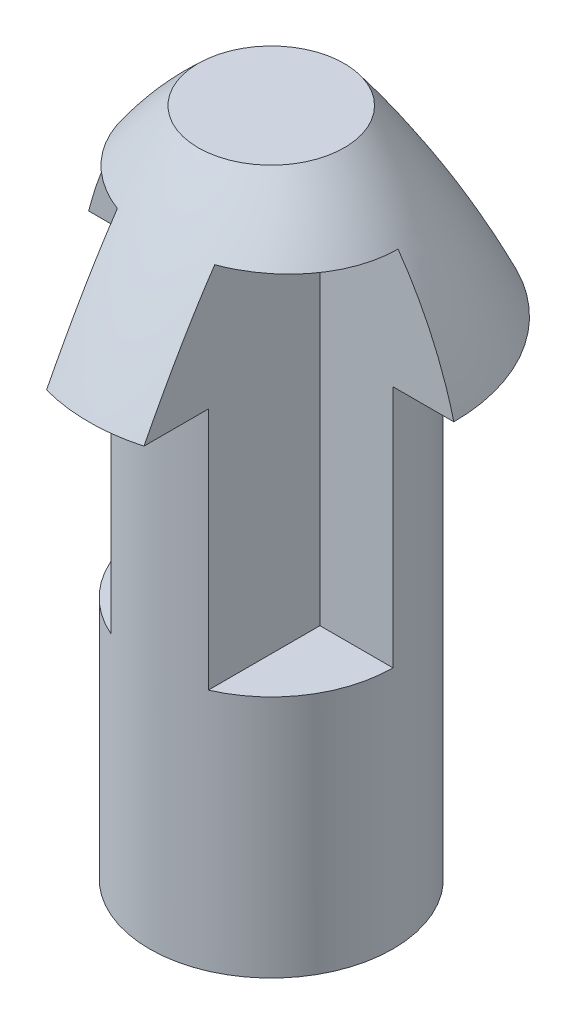
ISO-10303-21;
HEADER;
FILE_DESCRIPTION(('STEP AP214'),'2;1');
FILE_NAME('part.step','',(''),(''),'','','');
FILE_SCHEMA(('AUTOMOTIVE_DESIGN { 1 0 10303 214 1 1 1 1 }'));
ENDSEC;
DATA;
#1=APPLICATION_CONTEXT('core data for automotive mechanical design processes');
#2=APPLICATION_PROTOCOL_DEFINITION('international standard','automotive_design',2000,#1);
#3=PRODUCT_CONTEXT('',#1,'mechanical');
#4=PRODUCT('Part','Part','',(#3));
#5=PRODUCT_RELATED_PRODUCT_CATEGORY('part','',(#4));
#6=PRODUCT_DEFINITION_FORMATION('','',#4);
#7=PRODUCT_DEFINITION_CONTEXT('part definition',#1,'design');
#8=PRODUCT_DEFINITION('design','',#6,#7);
#9=PRODUCT_DEFINITION_SHAPE('','',#8);
#10=(LENGTH_UNIT() NAMED_UNIT(*) SI_UNIT(.MILLI.,.METRE.));
#11=(NAMED_UNIT(*) PLANE_ANGLE_UNIT() SI_UNIT($,.RADIAN.));
#12=(NAMED_UNIT(*) SI_UNIT($,.STERADIAN.) SOLID_ANGLE_UNIT());
#13=UNCERTAINTY_MEASURE_WITH_UNIT(LENGTH_MEASURE(1.E-05),#10,'distance_accuracy_value','');
#14=(GEOMETRIC_REPRESENTATION_CONTEXT(3) GLOBAL_UNCERTAINTY_ASSIGNED_CONTEXT((#13)) GLOBAL_UNIT_ASSIGNED_CONTEXT((#10,
#11,#12)) REPRESENTATION_CONTEXT('',''));
#15=CARTESIAN_POINT('',(0.,0.,0.));
#16=DIRECTION('',(0.,0.,1.));
#17=DIRECTION('',(1.,0.,0.));
#18=AXIS2_PLACEMENT_3D('',#15,#16,#17);
#19=CARTESIAN_POINT('',(0.,0.,0.));
#20=DIRECTION('',(0.,1.,0.));
#21=DIRECTION('',(0.,0.,1.));
#22=AXIS2_PLACEMENT_3D('',#19,#20,#21);
#23=PLANE('',#22);
#24=CARTESIAN_POINT('',(0.,0.,0.));
#25=DIRECTION('',(0.,-1.,0.));
#26=DIRECTION('',(0.,0.,-1.));
#27=AXIS2_PLACEMENT_3D('',#24,#25,#26);
#28=CIRCLE('',#27,10.);
#29=CARTESIAN_POINT('',(4.,0.,9.16515138991168));
#30=VERTEX_POINT('',#29);
#31=CARTESIAN_POINT('',(-4.,0.,9.16515138991168));
#32=VERTEX_POINT('',#31);
#33=EDGE_CURVE('E13',#30,#32,#28,.T.);
#34=ORIENTED_EDGE('',*,*,#33,.F.);
#35=DIRECTION('',(0.,0.,1.));
#36=VECTOR('',#35,1.);
#37=CARTESIAN_POINT('',(4.,0.,0.));
#38=LINE('',#37,#36);
#39=CARTESIAN_POINT('',(4.0000000661438,0.,14.4568025320352));
#40=VERTEX_POINT('',#39);
#41=EDGE_CURVE('E101',#30,#40,#38,.T.);
#42=ORIENTED_EDGE('',*,*,#41,.T.);
#43=CARTESIAN_POINT('',(0.,0.,0.));
#44=DIRECTION('',(0.,1.,0.));
#45=DIRECTION('',(0.,0.,1.));
#46=AXIS2_PLACEMENT_3D('',#43,#44,#45);
#47=CIRCLE('',#46,15.);
#48=CARTESIAN_POINT('',(-4.00000007553998,0.,14.4568091651516));
#49=VERTEX_POINT('',#48);
#50=EDGE_CURVE('E212',#49,#40,#47,.T.);
#51=ORIENTED_EDGE('',*,*,#50,.F.);
#52=DIRECTION('',(0.,0.,-1.));
#53=VECTOR('',#52,1.);
#54=CARTESIAN_POINT('',(-4.,0.,0.));
#55=LINE('',#54,#53);
#56=EDGE_CURVE('E200',#49,#32,#55,.T.);
#57=ORIENTED_EDGE('',*,*,#56,.T.);
#58=EDGE_LOOP('',(#34,#42,#51,#57));
#59=FACE_BOUND('',#58,.T.);
#60=ADVANCED_FACE('F96',(#59),#23,.F.);
#61=CARTESIAN_POINT('',(-6.,15.,0.));
#62=CARTESIAN_POINT('',(-10.4930125719809,10.8700221858486,0.));
#63=CARTESIAN_POINT('',(-13.4930125719809,5.87002218584861,0.));
#64=CARTESIAN_POINT('',(-15.,0.,0.));
#65=CARTESIAN_POINT('',(-6.,15.,-0.785398157130035));
#66=CARTESIAN_POINT('',(-10.4930125719809,10.8700221858486,-1.17809723569505));
#67=CARTESIAN_POINT('',(-13.4930125719809,5.87002218584861,-1.57079631426007));
#68=CARTESIAN_POINT('',(-15.,0.,-1.96349539282509));
#69=CARTESIAN_POINT('',(-5.68797868782459,15.,-2.35584175960413));
#70=CARTESIAN_POINT('',(-9.93158489609548,10.8700221858486,-3.533811112954));
#71=CARTESIAN_POINT('',(-12.7754918181343,5.87002218584861,-4.71178046630388));
#72=CARTESIAN_POINT('',(-14.219699453941,0.,-5.88974981965376));
#73=CARTESIAN_POINT('',(-4.35318411040885,15.,-4.35325667923756));
#74=CARTESIAN_POINT('',(-7.579565799637,10.8700221858486,-6.52990110745592));
#75=CARTESIAN_POINT('',(-9.75617302419109,5.87002218584861,-8.70654553567428));
#76=CARTESIAN_POINT('',(-10.8830057840711,0.,-10.8831899638926));
#77=CARTESIAN_POINT('',(-2.35602683389607,15.,-5.68774776566376));
#78=CARTESIAN_POINT('',(-4.09387988399612,10.8700221858486,-8.53163352915209));
#79=CARTESIAN_POINT('',(-5.27185321960334,5.8700221858486,-11.3755192926404));
#80=CARTESIAN_POINT('',(-5.88994684071773,0.,-14.2194050561288));
#81=CARTESIAN_POINT('',(0.,15.,-6.15644462987265));
#82=CARTESIAN_POINT('',(0.,10.8700221858486,-9.234659073821));
#83=CARTESIAN_POINT('',(0.,5.87002218584862,-12.3128735177694));
#84=CARTESIAN_POINT('',(0.,0.,-15.3910879617177));
#85=CARTESIAN_POINT('',(2.35602683389607,15.,-5.68774776566375));
#86=CARTESIAN_POINT('',(4.09387988399612,10.8700221858486,-8.53163352915209));
#87=CARTESIAN_POINT('',(5.27185321960334,5.8700221858486,-11.3755192926404));
#88=CARTESIAN_POINT('',(5.88994684071773,0.,-14.2194050561288));
#89=CARTESIAN_POINT('',(4.35318411040885,15.,-4.35325667923757));
#90=CARTESIAN_POINT('',(7.57956579963699,10.8700221858486,-6.52990110745593));
#91=CARTESIAN_POINT('',(9.75617302419108,5.87002218584862,-8.70654553567429));
#92=CARTESIAN_POINT('',(10.8830057840711,0.,-10.8831899638927));
#93=CARTESIAN_POINT('',(5.68797868782459,15.,-2.35584175960412));
#94=CARTESIAN_POINT('',(9.93158489609547,10.8700221858486,-3.533811112954));
#95=CARTESIAN_POINT('',(12.7754918181343,5.87002218584861,-4.71178046630387));
#96=CARTESIAN_POINT('',(14.219699453941,0.,-5.88974981965374));
#97=CARTESIAN_POINT('',(6.,15.,-0.785398157130034));
#98=CARTESIAN_POINT('',(10.4930125719809,10.8700221858486,-1.17809723569505));
#99=CARTESIAN_POINT('',(13.4930125719809,5.87002218584861,-1.57079631426007));
#100=CARTESIAN_POINT('',(15.,0.,-1.96349539282508));
#101=CARTESIAN_POINT('',(6.,15.,0.785398157130035));
#102=CARTESIAN_POINT('',(10.4930125719809,10.8700221858486,1.17809723569505));
#103=CARTESIAN_POINT('',(13.4930125719809,5.87002218584861,1.57079631426007));
#104=CARTESIAN_POINT('',(15.,0.,1.96349539282509));
#105=CARTESIAN_POINT('',(5.68797868782459,15.,2.35584175960413));
#106=CARTESIAN_POINT('',(9.93158489609548,10.8700221858486,3.53381111295401));
#107=CARTESIAN_POINT('',(12.7754918181343,5.87002218584861,4.71178046630389));
#108=CARTESIAN_POINT('',(14.219699453941,0.,5.88974981965377));
#109=CARTESIAN_POINT('',(4.35318411040886,15.,4.35325667923756));
#110=CARTESIAN_POINT('',(7.579565799637,10.8700221858486,6.52990110745591));
#111=CARTESIAN_POINT('',(9.75617302419108,5.87002218584862,8.70654553567426));
#112=CARTESIAN_POINT('',(10.8830057840711,0.,10.8831899638926));
#113=CARTESIAN_POINT('',(2.35602683389607,15.,5.68774776566376));
#114=CARTESIAN_POINT('',(4.09387988399613,10.8700221858486,8.5316335291521));
#115=CARTESIAN_POINT('',(5.27185321960335,5.87002218584861,11.3755192926404));
#116=CARTESIAN_POINT('',(5.88994684071774,0.,14.2194050561288));
#117=CARTESIAN_POINT('',(0.,15.,6.15644462987266));
#118=CARTESIAN_POINT('',(0.,10.8700221858486,9.234659073821));
#119=CARTESIAN_POINT('',(0.,5.87002218584861,12.3128735177694));
#120=CARTESIAN_POINT('',(0.,0.,15.3910879617177));
#121=CARTESIAN_POINT('',(-2.35602683389607,15.,5.68774776566375));
#122=CARTESIAN_POINT('',(-4.09387988399611,10.8700221858486,8.53163352915209));
#123=CARTESIAN_POINT('',(-5.27185321960333,5.87002218584862,11.3755192926404));
#124=CARTESIAN_POINT('',(-5.88994684071771,0.,14.2194050561288));
#125=CARTESIAN_POINT('',(-4.35318411040886,15.,4.35325667923756));
#126=CARTESIAN_POINT('',(-7.579565799637,10.8700221858486,6.52990110745593));
#127=CARTESIAN_POINT('',(-9.75617302419109,5.87002218584861,8.7065455356743));
#128=CARTESIAN_POINT('',(-10.8830057840711,0.,10.8831899638927));
#129=CARTESIAN_POINT('',(-5.68797868782459,15.,2.35584175960412));
#130=CARTESIAN_POINT('',(-9.93158489609547,10.8700221858486,3.533811112954));
#131=CARTESIAN_POINT('',(-12.7754918181343,5.87002218584862,4.71178046630387));
#132=CARTESIAN_POINT('',(-14.219699453941,0.,5.88974981965373));
#133=CARTESIAN_POINT('',(-6.,15.,0.785398157130033));
#134=CARTESIAN_POINT('',(-10.4930125719809,10.8700221858486,1.17809723569505));
#135=CARTESIAN_POINT('',(-13.4930125719809,5.87002218584861,1.57079631426007));
#136=CARTESIAN_POINT('',(-15.,0.,1.96349539282508));
#137=CARTESIAN_POINT('',(-6.,15.,0.));
#138=CARTESIAN_POINT('',(-10.4930125719809,10.8700221858486,0.));
#139=CARTESIAN_POINT('',(-13.4930125719809,5.87002218584861,0.));
#140=CARTESIAN_POINT('',(-15.,0.,0.));
#141=B_SPLINE_SURFACE_WITH_KNOTS('',3,3,((#61,#62,#63,#64),(#65,#66,#67,#68),(#69,#70,#71,#72),
(#73,#74,#75,#76),(#77,#78,#79,#80),(#81,#82,#83,#84),(#85,#86,#87,#88),(#89,#90,#91,#92),(#93,
#94,#95,#96),(#97,#98,#99,#100),(#101,#102,#103,#104),(#105,#106,#107,#108),(#109,#110,#111,
#112),(#113,#114,#115,#116),(#117,#118,#119,#120),(#121,#122,#123,#124),(#125,#126,#127,#128),
(#129,#130,#131,#132),(#133,#134,#135,#136),(#137,#138,#139,#140)),.UNSPECIFIED.,.T.,.F.,.F.,(4,
1,1,1,1,1,1,1,2,1,1,1,1,1,1,1,4),(4,4),(0.,0.0625,0.125,0.1875,0.25,0.3125,0.375,0.4375,0.5,
0.5625,0.625,0.6875,0.75,0.8125,0.875,0.9375,1.),(0.,1.),.UNSPECIFIED.);
#142=CARTESIAN_POINT('',(0.,15.,0.));
#143=DIRECTION('',(0.,1.,0.));
#144=DIRECTION('',(0.,0.,1.));
#145=AXIS2_PLACEMENT_3D('',#142,#143,#144);
#146=CIRCLE('',#145,6.);
#147=CARTESIAN_POINT('',(0.,15.,6.));
#148=VERTEX_POINT('',#147);
#149=EDGE_CURVE('E382',#148,#148,#146,.T.);
#150=CARTESIAN_POINT('',(-4.,10.,8.64258859620264));
#151=CARTESIAN_POINT('',(-4.29086096018243,10.,8.5328986738565));
#152=CARTESIAN_POINT('',(-4.57707961873381,10.,8.41082398460358));
#153=CARTESIAN_POINT('',(-5.13820512857223,10.,8.14252916734414));
#154=CARTESIAN_POINT('',(-5.41310403685442,10.,7.99629243384992));
#155=CARTESIAN_POINT('',(-5.95027054554151,10.,7.67979385233354));
#156=CARTESIAN_POINT('',(-6.21248082442782,10.,7.50943456304998));
#157=CARTESIAN_POINT('',(-6.72051034042688,10.,7.14589889122051));
#158=CARTESIAN_POINT('',(-6.96633417589159,10.,6.95272895231223));
#159=CARTESIAN_POINT('',(-7.42960721844239,10.,6.55221008214645));
#160=CARTESIAN_POINT('',(-7.6477898619061,10.,6.34571025034764));
#161=CARTESIAN_POINT('',(-8.06435210802118,10.,5.91354085724835));
#162=CARTESIAN_POINT('',(-8.26272919001311,10.,5.68786886264906));
#163=CARTESIAN_POINT('',(-8.63721292902052,10.,5.21934263431594));
#164=CARTESIAN_POINT('',(-8.81335519216698,10.,4.97651686837111));
#165=CARTESIAN_POINT('',(-9.14144796857638,10.,4.47501028865732));
#166=CARTESIAN_POINT('',(-9.29340436117066,10.,4.21633334938331));
#167=CARTESIAN_POINT('',(-9.4944757853947,10.,3.83111826711374));
#168=CARTESIAN_POINT('',(-9.55423228607267,10.,3.71004561229757));
#169=CARTESIAN_POINT('',(-9.66811179877024,10.,3.465280861741));
#170=CARTESIAN_POINT('',(-9.72223492410084,10.,3.34158881874782));
#171=CARTESIAN_POINT('',(-9.87594090059028,10.,2.96692449091666));
#172=CARTESIAN_POINT('',(-9.96687512575195,10.,2.71233574822307));
#173=CARTESIAN_POINT('',(-10.1243565155953,10.,2.19630526503741));
#174=CARTESIAN_POINT('',(-10.1909504142441,10.,1.9348777009943));
#175=CARTESIAN_POINT('',(-10.2989934634262,10.,1.40699588930055));
#176=CARTESIAN_POINT('',(-10.3404599456885,10.,1.14054523744297));
#177=CARTESIAN_POINT('',(-10.384378045291,10.,0.727741767364704));
#178=CARTESIAN_POINT('',(-10.396000591529,10.,0.582311904556055));
#179=CARTESIAN_POINT('',(-10.4115120030805,10.,0.29126348282013));
#180=CARTESIAN_POINT('',(-10.415412633537,10.,0.145645549730909));
#181=CARTESIAN_POINT('',(-10.4154123533874,10.,0.));
#182=B_SPLINE_CURVE_WITH_KNOTS('',3,(#150,#151,#152,#153,#154,#155,#156,#157,#158,#159,#160,
#161,#162,#163,#164,#165,#166,#167,#168,#169,#170,#171,#172,#173,#174,#175,#176,#177,#178,#179,
#180,#181),.UNSPECIFIED.,.F.,.F.,(4,2,2,2,2,2,2,2,2,2,2,2,2,2,2,4),(0.,0.932331587907555,
1.86530661116873,2.80216393539355,3.73875724290887,4.63874956065344,5.53885627505097,
6.4375027912457,7.33593052115732,7.74086011660259,8.14578156562678,8.95552916738354,
9.76371376554421,10.5713402789509,11.0088394117937,11.445671454544),.UNSPECIFIED.);
#183=CARTESIAN_POINT('',(-4.,10.,8.64258859620264));
#184=VERTEX_POINT('',#183);
#185=CARTESIAN_POINT('',(-10.4154123533874,9.99999999999999,0.));
#186=VERTEX_POINT('',#185);
#187=EDGE_CURVE('E194',#184,#186,#182,.T.);
#188=CARTESIAN_POINT('',(-4.,9.99999999999999,8.64258859620264));
#189=CARTESIAN_POINT('',(-4.,9.73466179057061,8.82330027259463));
#190=CARTESIAN_POINT('',(-4.,9.46780717256243,9.00176834978276));
#191=CARTESIAN_POINT('',(-4.,8.93146260885035,9.35462421589062));
#192=CARTESIAN_POINT('',(-4.,8.66197301576976,9.5290125404633));
#193=CARTESIAN_POINT('',(-4.,8.12069368883446,9.87415823137727));
#194=CARTESIAN_POINT('',(-4.,7.84890402286024,10.0449157043546));
#195=CARTESIAN_POINT('',(-4.,7.30351265848188,10.382965912948));
#196=CARTESIAN_POINT('',(-4.,7.02991277650525,10.550261580986));
#197=CARTESIAN_POINT('',(-4.,6.4808624240869,10.8818060536474));
#198=CARTESIAN_POINT('',(-4.,6.20541189471989,11.0460547606223));
#199=CARTESIAN_POINT('',(-4.,5.6528335881094,11.3717096108235));
#200=CARTESIAN_POINT('',(-4.,5.37570579534303,11.5331157276878));
#201=CARTESIAN_POINT('',(-4.,4.67923465962793,11.934296085332));
#202=CARTESIAN_POINT('',(-4.,4.25891659669303,12.17237936125));
#203=CARTESIAN_POINT('',(-4.,3.41518188016451,12.6429908608396));
#204=CARTESIAN_POINT('',(-4.,2.99176520567128,12.8755190469979));
#205=CARTESIAN_POINT('',(-4.,2.28348942478082,13.2588996572138));
#206=CARTESIAN_POINT('',(-4.,1.99940451216222,13.4111848778182));
#207=CARTESIAN_POINT('',(-4.,1.430067388183,13.7135552246853));
#208=CARTESIAN_POINT('',(-4.,1.14481518051206,13.8636403578954));
#209=CARTESIAN_POINT('',(-4.,0.573214562378268,14.1616947446172));
#210=CARTESIAN_POINT('',(-4.,0.286866173882871,14.3096640402519));
#211=CARTESIAN_POINT('',(-4.,0.,14.4566202682464));
#212=B_SPLINE_CURVE_WITH_KNOTS('',3,(#188,#189,#190,#191,#192,#193,#194,#195,#196,#197,#198,
#199,#200,#201,#202,#203,#204,#205,#206,#207,#208,#209,#210,#211),.UNSPECIFIED.,.F.,.F.,(4,2,2,
2,2,2,2,2,2,2,2,4),(0.,0.963068389742366,1.92600961517021,2.88892252039231,3.8509832870197,
4.8130748325682,5.77517529582499,7.2243188162711,8.67347211996532,9.64044551091883,
10.6074158477384,11.5743669068808),.UNSPECIFIED.);
#213=EDGE_CURVE('E294',#184,#49,#212,.T.);
#214=CARTESIAN_POINT('',(4.00000000305873,0.,14.4566202665565));
#215=CARTESIAN_POINT('',(4.00000000109966,0.285796630847645,14.310211975928));
#216=CARTESIAN_POINT('',(4.00000000029493,0.57107930777429,14.1627981306671));
#217=CARTESIAN_POINT('',(3.99999999970506,1.14055669915523,13.8658708139198));
#218=CARTESIAN_POINT('',(3.99999999991993,1.42475139266659,13.7163573022723));
#219=CARTESIAN_POINT('',(4.00000000008007,1.9919826193771,13.4151473076591));
#220=CARTESIAN_POINT('',(4.00000000002535,2.27501914926699,13.2634508184614));
#221=CARTESIAN_POINT('',(3.999999999962,2.98069001311918,12.881563036884));
#222=CARTESIAN_POINT('',(3.99999999998995,3.40255645913552,12.6499503193753));
#223=CARTESIAN_POINT('',(4.00000000001005,4.24321748301018,12.1812158202069));
#224=CARTESIAN_POINT('',(4.00000000000219,4.66201208113083,11.9440940749287));
#225=CARTESIAN_POINT('',(3.99999999999853,5.35805023095757,11.5433630758022));
#226=CARTESIAN_POINT('',(3.99999999999961,5.63624800296076,11.3814100909304));
#227=CARTESIAN_POINT('',(4.00000000000039,6.19095659232929,11.0546438138474));
#228=CARTESIAN_POINT('',(4.0000000000001,6.46746742522738,10.8898305480265));
#229=CARTESIAN_POINT('',(3.9999999999999,7.01862730797252,10.5571376180086));
#230=CARTESIAN_POINT('',(3.99999999999997,7.29327641743837,10.3892580526471));
#231=CARTESIAN_POINT('',(4.00000000000003,7.84075507615989,10.05001754023));
#232=CARTESIAN_POINT('',(4.00000000000001,8.1135827928061,9.87865363371925));
#233=CARTESIAN_POINT('',(3.99999999999999,8.65692328115647,9.53227060532842));
#234=CARTESIAN_POINT('',(4.,8.92743598420931,9.35725137557625));
#235=CARTESIAN_POINT('',(4.,9.46580853545034,9.00310470560708));
#236=CARTESIAN_POINT('',(4.00000000000001,9.73366802614967,8.82397672228172));
#237=CARTESIAN_POINT('',(4.,9.99999999999999,8.64258859620264));
#238=B_SPLINE_CURVE_WITH_KNOTS('',3,(#214,#215,#216,#217,#218,#219,#220,#221,#222,#223,#224,
#225,#226,#227,#228,#229,#230,#231,#232,#233,#234,#235,#236,#237),.UNSPECIFIED.,.F.,.F.,(4,2,2,
2,2,2,2,2,2,2,2,4),(0.,0.963345864077268,1.92671017959437,2.8900772458456,4.33383259305007,
5.77757840846772,6.74327821018885,7.70896910662588,8.67462893080999,9.64114637269519,
10.6076923778495,11.5743668889529),.UNSPECIFIED.);
#239=CARTESIAN_POINT('',(4.,9.99999999999999,8.64258859620264));
#240=VERTEX_POINT('',#239);
#241=EDGE_CURVE('E368',#40,#240,#238,.T.);
#242=CARTESIAN_POINT('',(10.4154123533874,10.,0.));
#243=CARTESIAN_POINT('',(10.4154342468021,10.,0.23994242772249));
#244=CARTESIAN_POINT('',(10.4048293892964,10.,0.479845448594156));
#245=CARTESIAN_POINT('',(10.362936530822,10.,0.957768642607566));
#246=CARTESIAN_POINT('',(10.3316550366848,10.,1.19578938425424));
#247=CARTESIAN_POINT('',(10.2491251595887,10.,1.66745930207702));
#248=CARTESIAN_POINT('',(10.1979479766136,10.,1.90112098746337));
#249=CARTESIAN_POINT('',(10.0762902055388,10.,2.36336039435657));
#250=CARTESIAN_POINT('',(10.0058092926789,10.,2.59193803026092));
#251=CARTESIAN_POINT('',(9.84634571326154,10.,3.04231869382956));
#252=CARTESIAN_POINT('',(9.75737908356211,10.,3.26412740368771));
#253=CARTESIAN_POINT('',(9.56165641707473,10.,3.69973286509278));
#254=CARTESIAN_POINT('',(9.45490093614656,10.,3.91352986673113));
#255=CARTESIAN_POINT('',(9.22476161784097,10.,4.33209965364214));
#256=CARTESIAN_POINT('',(9.10136942183674,10.,4.53686783357596));
#257=CARTESIAN_POINT('',(8.8392324764874,10.,4.93633324821357));
#258=CARTESIAN_POINT('',(8.70048652260788,10.,5.13102969100768));
#259=CARTESIAN_POINT('',(8.39973265527922,10.,5.52124637333997));
#260=CARTESIAN_POINT('',(8.2368148345571,10.,5.71606538524605));
#261=CARTESIAN_POINT('',(7.89630555714117,10.,6.09241433112896));
#262=CARTESIAN_POINT('',(7.71871404302698,10.,6.27394421309816));
#263=CARTESIAN_POINT('',(7.34995873448872,10.,6.62289096255414));
#264=CARTESIAN_POINT('',(7.15878608695088,10.,6.79029846567967));
#265=CARTESIAN_POINT('',(6.76443718471334,10.,7.11029056683678));
#266=CARTESIAN_POINT('',(6.56126134736376,10.,7.26287567975467));
#267=CARTESIAN_POINT('',(6.17032917232203,10.,7.5348161029265));
#268=CARTESIAN_POINT('',(5.98380062054271,10.,7.65594365464959));
#269=CARTESIAN_POINT('',(5.60355618321435,10.,7.88630935824925));
#270=CARTESIAN_POINT('',(5.4098407591614,10.,7.99554827177419));
#271=CARTESIAN_POINT('',(5.01658156282015,10.,8.20161606649554));
#272=CARTESIAN_POINT('',(4.81705469350371,10.,8.29847723530205));
#273=CARTESIAN_POINT('',(4.41247614598127,10.,8.47985612994211));
#274=CARTESIAN_POINT('',(4.20742469080659,10.,8.56437435318707));
#275=CARTESIAN_POINT('',(3.99999999999999,10.,8.64258859620264));
#276=B_SPLINE_CURVE_WITH_KNOTS('',3,(#242,#243,#244,#245,#246,#247,#248,#249,#250,#251,#252,
#253,#254,#255,#256,#257,#258,#259,#260,#261,#262,#263,#264,#265,#266,#267,#268,#269,#270,#271,
#272,#273,#274,#275),.UNSPECIFIED.,.F.,.F.,(4,2,2,2,2,2,2,2,2,2,2,2,2,2,2,2,4),(0.,
0.719535904387428,1.43884548224835,2.15560424373169,2.87237506449445,3.58852664418289,
4.30465585001303,5.02114620398719,5.73769280803191,6.49878466678467,7.25987950394672,
8.02147510978986,8.78304425057,9.44983621136516,10.1165854288003,10.7815582830724,
11.4465043320394),.UNSPECIFIED.);
#277=CARTESIAN_POINT('',(10.4154123533874,10.,0.));
#278=VERTEX_POINT('',#277);
#279=EDGE_CURVE('E216',#278,#240,#276,.T.);
#280=CARTESIAN_POINT('',(10.4154123533874,10.,0.));
#281=CARTESIAN_POINT('',(10.6778682984596,9.62838289385548,0.));
#282=CARTESIAN_POINT('',(10.9317790199829,9.25072556484334,0.));
#283=CARTESIAN_POINT('',(11.4219254661143,8.48411821601424,0.));
#284=CARTESIAN_POINT('',(11.6581614382921,8.09516835447743,0.));
#285=CARTESIAN_POINT('',(12.110525455749,7.30997439879662,0.));
#286=CARTESIAN_POINT('',(12.3268020342388,6.9138158772601,0.));
#287=CARTESIAN_POINT('',(12.7410208227094,6.11203729052765,0.));
#288=CARTESIAN_POINT('',(12.9389632721587,5.70641734899735,0.));
#289=CARTESIAN_POINT('',(13.3227952194085,4.87250605244586,0.));
#290=CARTESIAN_POINT('',(13.5080339957943,4.44391517700124,0.));
#291=CARTESIAN_POINT('',(13.858597010975,3.57864298400565,0.));
#292=CARTESIAN_POINT('',(14.0239200738463,3.14196119048101,0.));
#293=CARTESIAN_POINT('',(14.3360731068974,2.25784420938273,0.));
#294=CARTESIAN_POINT('',(14.4827327524665,1.81034898385642,0.));
#295=CARTESIAN_POINT('',(14.7561817539375,0.909393666215746,0.));
#296=CARTESIAN_POINT('',(14.8829739602394,0.455934439899592,0.));
#297=CARTESIAN_POINT('',(15.,0.,0.));
#298=B_SPLINE_CURVE_WITH_KNOTS('',3,(#280,#281,#282,#283,#284,#285,#286,#287,#288,#289,#290,
#291,#292,#293,#294,#295,#296,#297),.UNSPECIFIED.,.F.,.F.,(4,2,2,2,2,2,2,2,4),(0.,
1.36474634130042,2.72947356305633,4.0830492885955,5.4366073321045,6.83682593079103,
8.23712716492854,9.64940906199775,11.061488151775),.UNSPECIFIED.);
#299=CARTESIAN_POINT('',(15.,0.,0.));
#300=VERTEX_POINT('',#299);
#301=EDGE_CURVE('E317',#278,#300,#298,.T.);
#302=CARTESIAN_POINT('',(-15.,0.,0.));
#303=VERTEX_POINT('',#302);
#304=EDGE_CURVE('E215',#300,#303,#47,.T.);
#305=CARTESIAN_POINT('',(-6.,15.,0.));
#306=CARTESIAN_POINT('',(-10.4930125719809,10.8700221858486,0.));
#307=CARTESIAN_POINT('',(-13.4930125719809,5.87002218584861,0.));
#308=CARTESIAN_POINT('',(-15.,0.,0.));
#309=B_SPLINE_CURVE_WITH_KNOTS('',3,(#305,#306,#307,#308),.UNSPECIFIED.,.F.,.F.,(4,4),(0.,1.),.UNSPECIFIED.);
#310=EDGE_CURVE('E198',#303,#186,#309,.F.);
#311=ORIENTED_EDGE('',*,*,#149,.F.);
#312=EDGE_LOOP('',(#311));
#313=FACE_BOUND('',#312,.T.);
#314=ORIENTED_EDGE('',*,*,#187,.F.);
#315=ORIENTED_EDGE('',*,*,#213,.T.);
#316=ORIENTED_EDGE('',*,*,#50,.T.);
#317=ORIENTED_EDGE('',*,*,#241,.T.);
#318=ORIENTED_EDGE('',*,*,#279,.F.);
#319=ORIENTED_EDGE('',*,*,#301,.T.);
#320=ORIENTED_EDGE('',*,*,#304,.T.);
#321=ORIENTED_EDGE('',*,*,#310,.T.);
#322=EDGE_LOOP('',(#314,#315,#316,#317,#318,#319,#320,#321));
#323=FACE_BOUND('',#322,.T.);
#324=ADVANCED_FACE('F238',(#313,#323),#141,.T.);
#325=CARTESIAN_POINT('',(-10.,0.,0.));
#326=VERTEX_POINT('',#325);
#327=CARTESIAN_POINT('',(10.,0.,0.));
#328=VERTEX_POINT('',#327);
#329=EDGE_CURVE('E107',#326,#328,#28,.T.);
#330=ORIENTED_EDGE('',*,*,#329,.F.);
#331=DIRECTION('',(-1.,0.,0.));
#332=VECTOR('',#331,1.);
#333=CARTESIAN_POINT('',(-4.,0.,0.));
#334=LINE('',#333,#332);
#335=EDGE_CURVE('E190',#326,#303,#334,.T.);
#336=ORIENTED_EDGE('',*,*,#335,.T.);
#337=ORIENTED_EDGE('',*,*,#304,.F.);
#338=DIRECTION('',(-1.,0.,0.));
#339=VECTOR('',#338,1.);
#340=CARTESIAN_POINT('',(4.,0.,0.));
#341=LINE('',#340,#339);
#342=EDGE_CURVE('E193',#300,#328,#341,.T.);
#343=ORIENTED_EDGE('',*,*,#342,.T.);
#344=EDGE_LOOP('',(#330,#336,#337,#343));
#345=FACE_BOUND('',#344,.T.);
#346=ADVANCED_FACE('F98',(#345),#23,.F.);
#347=CARTESIAN_POINT('',(0.,15.,0.));
#348=DIRECTION('',(0.,1.,0.));
#349=DIRECTION('',(0.,0.,1.));
#350=AXIS2_PLACEMENT_3D('',#347,#348,#349);
#351=PLANE('',#350);
#352=ORIENTED_EDGE('',*,*,#149,.T.);
#353=EDGE_LOOP('',(#352));
#354=FACE_BOUND('',#353,.T.);
#355=ADVANCED_FACE('F250',(#354),#351,.T.);
#356=CARTESIAN_POINT('',(4.,-56.9328942361405,0.));
#357=DIRECTION('',(0.,0.,1.));
#358=DIRECTION('',(1.,0.,0.));
#359=AXIS2_PLACEMENT_3D('',#356,#357,#358);
#360=PLANE('',#359);
#361=ORIENTED_EDGE('',*,*,#301,.F.);
#362=DIRECTION('',(-1.,0.,0.));
#363=VECTOR('',#362,1.);
#364=CARTESIAN_POINT('',(4.,9.99999999999999,0.));
#365=LINE('',#364,#363);
#366=CARTESIAN_POINT('',(4.,9.99999999999999,0.));
#367=VERTEX_POINT('',#366);
#368=EDGE_CURVE('E374',#278,#367,#365,.T.);
#369=ORIENTED_EDGE('',*,*,#368,.T.);
#370=DIRECTION('',(0.,1.,0.));
#371=VECTOR('',#370,1.);
#372=CARTESIAN_POINT('',(4.,-56.9328942361405,0.));
#373=LINE('',#372,#371);
#374=CARTESIAN_POINT('',(4.,-20.,0.));
#375=VERTEX_POINT('',#374);
#376=EDGE_CURVE('E381',#375,#367,#373,.T.);
#377=ORIENTED_EDGE('',*,*,#376,.F.);
#378=DIRECTION('',(-1.,0.,0.));
#379=VECTOR('',#378,1.);
#380=CARTESIAN_POINT('',(4.,-20.,0.));
#381=LINE('',#380,#379);
#382=CARTESIAN_POINT('',(10.,-20.,0.));
#383=VERTEX_POINT('',#382);
#384=EDGE_CURVE('E354',#383,#375,#381,.T.);
#385=ORIENTED_EDGE('',*,*,#384,.F.);
#386=DIRECTION('',(0.,-1.,0.));
#387=VECTOR('',#386,1.);
#388=CARTESIAN_POINT('',(10.,87.276167770928,0.));
#389=LINE('',#388,#387);
#390=EDGE_CURVE('E347',#328,#383,#389,.T.);
#391=ORIENTED_EDGE('',*,*,#390,.F.);
#392=ORIENTED_EDGE('',*,*,#342,.F.);
#393=EDGE_LOOP('',(#361,#369,#377,#385,#391,#392));
#394=FACE_BOUND('',#393,.T.);
#395=ADVANCED_FACE('F377',(#394),#360,.T.);
#396=CARTESIAN_POINT('',(4.,-56.9328942361405,0.));
#397=DIRECTION('',(1.,0.,0.));
#398=DIRECTION('',(0.,0.,-1.));
#399=AXIS2_PLACEMENT_3D('',#396,#397,#398);
#400=PLANE('',#399);
#401=ORIENTED_EDGE('',*,*,#241,.F.);
#402=ORIENTED_EDGE('',*,*,#41,.F.);
#403=DIRECTION('',(0.,-1.,0.));
#404=VECTOR('',#403,1.);
#405=CARTESIAN_POINT('',(4.,87.276167770928,9.16515138991168));
#406=LINE('',#405,#404);
#407=CARTESIAN_POINT('',(4.,-20.,9.16515138991168));
#408=VERTEX_POINT('',#407);
#409=EDGE_CURVE('E123',#30,#408,#406,.T.);
#410=ORIENTED_EDGE('',*,*,#409,.T.);
#411=DIRECTION('',(0.,0.,1.));
#412=VECTOR('',#411,1.);
#413=CARTESIAN_POINT('',(4.,-20.,9.16515138991168));
#414=LINE('',#413,#412);
#415=EDGE_CURVE('E351',#375,#408,#414,.T.);
#416=ORIENTED_EDGE('',*,*,#415,.F.);
#417=ORIENTED_EDGE('',*,*,#376,.T.);
#418=DIRECTION('',(0.,0.,1.));
#419=VECTOR('',#418,1.);
#420=CARTESIAN_POINT('',(4.,9.99999999999999,0.));
#421=LINE('',#420,#419);
#422=EDGE_CURVE('E324',#367,#240,#421,.T.);
#423=ORIENTED_EDGE('',*,*,#422,.T.);
#424=EDGE_LOOP('',(#401,#402,#410,#416,#417,#423));
#425=FACE_BOUND('',#424,.T.);
#426=ADVANCED_FACE('F309',(#425),#400,.T.);
#427=CARTESIAN_POINT('',(0.,10.,0.));
#428=DIRECTION('',(0.,1.,0.));
#429=DIRECTION('',(0.,0.,1.));
#430=AXIS2_PLACEMENT_3D('',#427,#428,#429);
#431=PLANE('',#430);
#432=ORIENTED_EDGE('',*,*,#368,.F.);
#433=ORIENTED_EDGE('',*,*,#279,.T.);
#434=ORIENTED_EDGE('',*,*,#422,.F.);
#435=EDGE_LOOP('',(#432,#433,#434));
#436=FACE_BOUND('',#435,.T.);
#437=ADVANCED_FACE('F302',(#436),#431,.F.);
#438=CARTESIAN_POINT('',(-4.,-75.6837131003154,0.));
#439=DIRECTION('',(-1.,0.,0.));
#440=DIRECTION('',(0.,0.,1.));
#441=AXIS2_PLACEMENT_3D('',#438,#439,#440);
#442=PLANE('',#441);
#443=ORIENTED_EDGE('',*,*,#213,.F.);
#444=DIRECTION('',(0.,0.,-1.));
#445=VECTOR('',#444,1.);
#446=CARTESIAN_POINT('',(-4.,9.99999999999999,0.));
#447=LINE('',#446,#445);
#448=CARTESIAN_POINT('',(-4.,9.99999999999999,0.));
#449=VERTEX_POINT('',#448);
#450=EDGE_CURVE('E201',#184,#449,#447,.T.);
#451=ORIENTED_EDGE('',*,*,#450,.T.);
#452=DIRECTION('',(0.,1.,0.));
#453=VECTOR('',#452,1.);
#454=CARTESIAN_POINT('',(-4.,-75.6837131003154,0.));
#455=LINE('',#454,#453);
#456=CARTESIAN_POINT('',(-4.,-20.,0.));
#457=VERTEX_POINT('',#456);
#458=EDGE_CURVE('E326',#457,#449,#455,.T.);
#459=ORIENTED_EDGE('',*,*,#458,.F.);
#460=DIRECTION('',(0.,0.,-1.));
#461=VECTOR('',#460,1.);
#462=CARTESIAN_POINT('',(-4.,-20.,0.));
#463=LINE('',#462,#461);
#464=CARTESIAN_POINT('',(-4.,-20.,9.16515138991168));
#465=VERTEX_POINT('',#464);
#466=EDGE_CURVE('E185',#465,#457,#463,.T.);
#467=ORIENTED_EDGE('',*,*,#466,.F.);
#468=DIRECTION('',(0.,-1.,0.));
#469=VECTOR('',#468,1.);
#470=CARTESIAN_POINT('',(-4.,87.276167770928,9.16515138991168));
#471=LINE('',#470,#469);
#472=EDGE_CURVE('E184',#32,#465,#471,.T.);
#473=ORIENTED_EDGE('',*,*,#472,.F.);
#474=ORIENTED_EDGE('',*,*,#56,.F.);
#475=EDGE_LOOP('',(#443,#451,#459,#467,#473,#474));
#476=FACE_BOUND('',#475,.T.);
#477=ADVANCED_FACE('F297',(#476),#442,.T.);
#478=CARTESIAN_POINT('',(-4.,-75.6837131003154,0.));
#479=DIRECTION('',(0.,0.,1.));
#480=DIRECTION('',(1.,0.,0.));
#481=AXIS2_PLACEMENT_3D('',#478,#479,#480);
#482=PLANE('',#481);
#483=ORIENTED_EDGE('',*,*,#310,.F.);
#484=ORIENTED_EDGE('',*,*,#335,.F.);
#485=DIRECTION('',(0.,-1.,0.));
#486=VECTOR('',#485,1.);
#487=CARTESIAN_POINT('',(-10.,87.276167770928,0.));
#488=LINE('',#487,#486);
#489=CARTESIAN_POINT('',(-10.,-20.,0.));
#490=VERTEX_POINT('',#489);
#491=EDGE_CURVE('E115',#326,#490,#488,.T.);
#492=ORIENTED_EDGE('',*,*,#491,.T.);
#493=DIRECTION('',(-1.,0.,0.));
#494=VECTOR('',#493,1.);
#495=CARTESIAN_POINT('',(-4.,-20.,0.));
#496=LINE('',#495,#494);
#497=EDGE_CURVE('E359',#457,#490,#496,.T.);
#498=ORIENTED_EDGE('',*,*,#497,.F.);
#499=ORIENTED_EDGE('',*,*,#458,.T.);
#500=DIRECTION('',(-1.,0.,0.));
#501=VECTOR('',#500,1.);
#502=CARTESIAN_POINT('',(-4.,9.99999999999999,0.));
#503=LINE('',#502,#501);
#504=EDGE_CURVE('E199',#449,#186,#503,.T.);
#505=ORIENTED_EDGE('',*,*,#504,.T.);
#506=EDGE_LOOP('',(#483,#484,#492,#498,#499,#505));
#507=FACE_BOUND('',#506,.T.);
#508=ADVANCED_FACE('F196',(#507),#482,.T.);
#509=CARTESIAN_POINT('',(0.,10.,0.));
#510=DIRECTION('',(0.,1.,0.));
#511=DIRECTION('',(0.,0.,1.));
#512=AXIS2_PLACEMENT_3D('',#509,#510,#511);
#513=PLANE('',#512);
#514=ORIENTED_EDGE('',*,*,#450,.F.);
#515=ORIENTED_EDGE('',*,*,#187,.T.);
#516=ORIENTED_EDGE('',*,*,#504,.F.);
#517=EDGE_LOOP('',(#514,#515,#516));
#518=FACE_BOUND('',#517,.T.);
#519=ADVANCED_FACE('F305',(#518),#513,.F.);
#520=CARTESIAN_POINT('',(0.,-40.,0.));
#521=DIRECTION('',(0.,1.,0.));
#522=DIRECTION('',(0.,0.,1.));
#523=AXIS2_PLACEMENT_3D('',#520,#521,#522);
#524=CYLINDRICAL_SURFACE('',#523,10.);
#525=CARTESIAN_POINT('',(0.,-40.,0.));
#526=DIRECTION('',(0.,-1.,0.));
#527=DIRECTION('',(0.,0.,-1.));
#528=AXIS2_PLACEMENT_3D('',#525,#526,#527);
#529=CIRCLE('',#528,10.);
#530=CARTESIAN_POINT('',(0.,-40.,-10.));
#531=VERTEX_POINT('',#530);
#532=EDGE_CURVE('E204',#531,#531,#529,.T.);
#533=ORIENTED_EDGE('',*,*,#532,.F.);
#534=EDGE_LOOP('',(#533));
#535=FACE_BOUND('',#534,.T.);
#536=ORIENTED_EDGE('',*,*,#33,.T.);
#537=ORIENTED_EDGE('',*,*,#472,.T.);
#538=CARTESIAN_POINT('',(0.,-20.,0.));
#539=DIRECTION('',(0.,-1.,0.));
#540=DIRECTION('',(0.,0.,-1.));
#541=AXIS2_PLACEMENT_3D('',#538,#539,#540);
#542=CIRCLE('',#541,10.);
#543=EDGE_CURVE('E183',#465,#490,#542,.T.);
#544=ORIENTED_EDGE('',*,*,#543,.T.);
#545=ORIENTED_EDGE('',*,*,#491,.F.);
#546=ORIENTED_EDGE('',*,*,#329,.T.);
#547=ORIENTED_EDGE('',*,*,#390,.T.);
#548=CARTESIAN_POINT('',(0.,-20.,0.));
#549=DIRECTION('',(0.,-1.,0.));
#550=DIRECTION('',(0.,0.,-1.));
#551=AXIS2_PLACEMENT_3D('',#548,#549,#550);
#552=CIRCLE('',#551,10.);
#553=EDGE_CURVE('E348',#383,#408,#552,.T.);
#554=ORIENTED_EDGE('',*,*,#553,.T.);
#555=ORIENTED_EDGE('',*,*,#409,.F.);
#556=EDGE_LOOP('',(#536,#537,#544,#545,#546,#547,#554,#555));
#557=FACE_BOUND('',#556,.T.);
#558=ADVANCED_FACE('F180',(#535,#557),#524,.T.);
#559=CARTESIAN_POINT('',(0.,-40.,0.));
#560=DIRECTION('',(0.,-1.,0.));
#561=DIRECTION('',(0.,0.,-1.));
#562=AXIS2_PLACEMENT_3D('',#559,#560,#561);
#563=PLANE('',#562);
#564=ORIENTED_EDGE('',*,*,#532,.T.);
#565=EDGE_LOOP('',(#564));
#566=FACE_BOUND('',#565,.T.);
#567=ADVANCED_FACE('F442',(#566),#563,.T.);
#568=CARTESIAN_POINT('',(0.,-20.,0.));
#569=DIRECTION('',(0.,-1.,0.));
#570=DIRECTION('',(0.,0.,-1.));
#571=AXIS2_PLACEMENT_3D('',#568,#569,#570);
#572=PLANE('',#571);
#573=ORIENTED_EDGE('',*,*,#553,.F.);
#574=ORIENTED_EDGE('',*,*,#384,.T.);
#575=ORIENTED_EDGE('',*,*,#415,.T.);
#576=EDGE_LOOP('',(#573,#574,#575));
#577=FACE_BOUND('',#576,.T.);
#578=ADVANCED_FACE('F380',(#577),#572,.F.);
#579=CARTESIAN_POINT('',(0.,-20.,0.));
#580=DIRECTION('',(0.,-1.,0.));
#581=DIRECTION('',(0.,0.,-1.));
#582=AXIS2_PLACEMENT_3D('',#579,#580,#581);
#583=PLANE('',#582);
#584=ORIENTED_EDGE('',*,*,#543,.F.);
#585=ORIENTED_EDGE('',*,*,#466,.T.);
#586=ORIENTED_EDGE('',*,*,#497,.T.);
#587=EDGE_LOOP('',(#584,#585,#586));
#588=FACE_BOUND('',#587,.T.);
#589=ADVANCED_FACE('F365',(#588),#583,.F.);
#590=CLOSED_SHELL('',(#60,#324,#346,#355,#395,#426,#437,#477,#508,#519,#558,#567,#578,#589));
#591=MANIFOLD_SOLID_BREP('B2',#590);
#592=ADVANCED_BREP_SHAPE_REPRESENTATION('',(#18,#591),#14);
#593=SHAPE_DEFINITION_REPRESENTATION(#9,#592);
ENDSEC;
END-ISO-10303-21;
